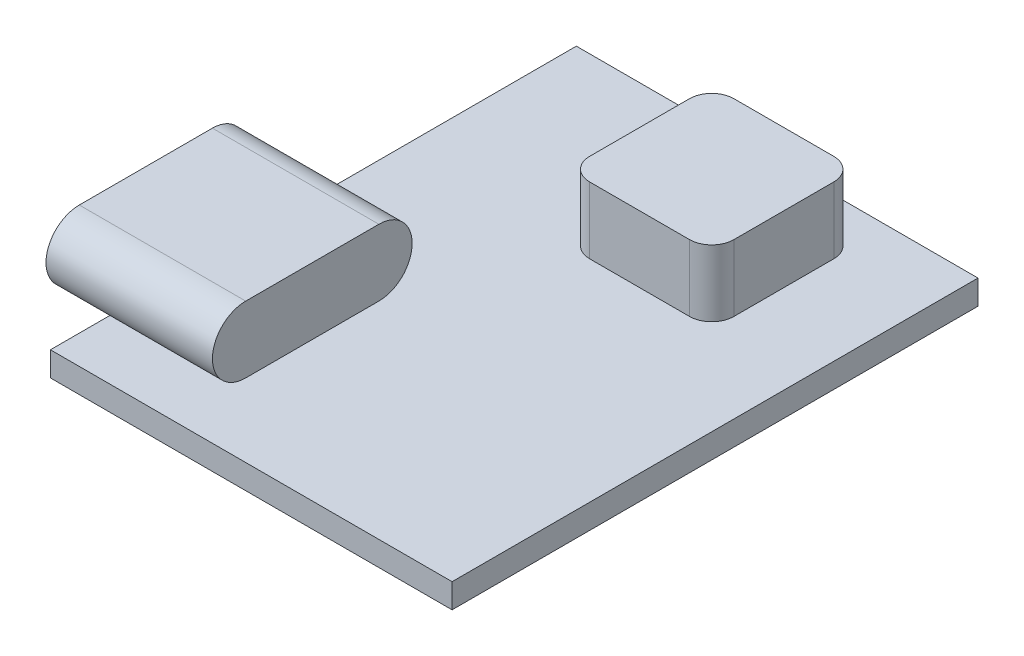
ISO-10303-21;
HEADER;
FILE_DESCRIPTION(('STEP AP214'),'2;1');
FILE_NAME('part.step','',(''),(''),'','','');
FILE_SCHEMA(('AUTOMOTIVE_DESIGN { 1 0 10303 214 1 1 1 1 }'));
ENDSEC;
DATA;
#1=APPLICATION_CONTEXT('core data for automotive mechanical design processes');
#2=APPLICATION_PROTOCOL_DEFINITION('international standard','automotive_design',2000,#1);
#3=PRODUCT_CONTEXT('',#1,'mechanical');
#4=PRODUCT('Part','Part','',(#3));
#5=PRODUCT_RELATED_PRODUCT_CATEGORY('part','',(#4));
#6=PRODUCT_DEFINITION_FORMATION('','',#4);
#7=PRODUCT_DEFINITION_CONTEXT('part definition',#1,'design');
#8=PRODUCT_DEFINITION('design','',#6,#7);
#9=PRODUCT_DEFINITION_SHAPE('','',#8);
#10=(LENGTH_UNIT() NAMED_UNIT(*) SI_UNIT(.MILLI.,.METRE.));
#11=(NAMED_UNIT(*) PLANE_ANGLE_UNIT() SI_UNIT($,.RADIAN.));
#12=(NAMED_UNIT(*) SI_UNIT($,.STERADIAN.) SOLID_ANGLE_UNIT());
#13=UNCERTAINTY_MEASURE_WITH_UNIT(LENGTH_MEASURE(1.E-05),#10,'distance_accuracy_value','');
#14=(GEOMETRIC_REPRESENTATION_CONTEXT(3) GLOBAL_UNCERTAINTY_ASSIGNED_CONTEXT((#13)) GLOBAL_UNIT_ASSIGNED_CONTEXT((#10,
#11,#12)) REPRESENTATION_CONTEXT('',''));
#15=CARTESIAN_POINT('',(0.,0.,0.));
#16=DIRECTION('',(0.,0.,1.));
#17=DIRECTION('',(1.,0.,0.));
#18=AXIS2_PLACEMENT_3D('',#15,#16,#17);
#19=CARTESIAN_POINT('',(-1.45,4.1,-10.35));
#20=DIRECTION('',(1.,0.,0.));
#21=DIRECTION('',(0.,0.,-1.));
#22=AXIS2_PLACEMENT_3D('',#19,#20,#21);
#23=PLANE('',#22);
#24=DIRECTION('',(0.,0.,1.));
#25=VECTOR('',#24,1.);
#26=CARTESIAN_POINT('',(-1.45,4.1,-10.35));
#27=LINE('',#26,#25);
#28=CARTESIAN_POINT('',(-1.45,4.1,-9.35));
#29=VERTEX_POINT('',#28);
#30=CARTESIAN_POINT('',(-1.45,4.1,-4.85));
#31=VERTEX_POINT('',#30);
#32=EDGE_CURVE('E144',#29,#31,#27,.T.);
#33=ORIENTED_EDGE('',*,*,#32,.F.);
#34=DIRECTION('',(0.,-1.,0.));
#35=VECTOR('',#34,1.);
#36=CARTESIAN_POINT('',(-1.45,4.1,-9.35));
#37=LINE('',#36,#35);
#38=CARTESIAN_POINT('',(-1.45,1.1,-9.35));
#39=VERTEX_POINT('',#38);
#40=EDGE_CURVE('E170',#29,#39,#37,.T.);
#41=ORIENTED_EDGE('',*,*,#40,.T.);
#42=DIRECTION('',(0.,0.,1.));
#43=VECTOR('',#42,1.);
#44=CARTESIAN_POINT('',(-1.45,1.1,-10.35));
#45=LINE('',#44,#43);
#46=CARTESIAN_POINT('',(-1.45,1.1,-4.85));
#47=VERTEX_POINT('',#46);
#48=EDGE_CURVE('E176',#39,#47,#45,.T.);
#49=ORIENTED_EDGE('',*,*,#48,.T.);
#50=DIRECTION('',(0.,-1.,0.));
#51=VECTOR('',#50,1.);
#52=CARTESIAN_POINT('',(-1.45,4.1,-4.85));
#53=LINE('',#52,#51);
#54=EDGE_CURVE('E168',#47,#31,#53,.F.);
#55=ORIENTED_EDGE('',*,*,#54,.T.);
#56=EDGE_LOOP('',(#33,#41,#49,#55));
#57=FACE_BOUND('',#56,.T.);
#58=ADVANCED_FACE('F52',(#57),#23,.F.);
#59=CARTESIAN_POINT('',(-1.45,4.1,-3.85));
#60=DIRECTION('',(0.,0.,-1.));
#61=DIRECTION('',(-1.,0.,0.));
#62=AXIS2_PLACEMENT_3D('',#59,#60,#61);
#63=PLANE('',#62);
#64=DIRECTION('',(1.,0.,0.));
#65=VECTOR('',#64,1.);
#66=CARTESIAN_POINT('',(-1.45,4.1,-3.85));
#67=LINE('',#66,#65);
#68=CARTESIAN_POINT('',(-0.449999999999999,4.1,-3.85));
#69=VERTEX_POINT('',#68);
#70=CARTESIAN_POINT('',(4.05,4.1,-3.85));
#71=VERTEX_POINT('',#70);
#72=EDGE_CURVE('E147',#69,#71,#67,.T.);
#73=ORIENTED_EDGE('',*,*,#72,.F.);
#74=DIRECTION('',(0.,-1.,0.));
#75=VECTOR('',#74,1.);
#76=CARTESIAN_POINT('',(-0.449999999999999,4.1,-3.85));
#77=LINE('',#76,#75);
#78=CARTESIAN_POINT('',(-0.449999999999999,1.1,-3.85));
#79=VERTEX_POINT('',#78);
#80=EDGE_CURVE('E12',#69,#79,#77,.T.);
#81=ORIENTED_EDGE('',*,*,#80,.T.);
#82=DIRECTION('',(1.,0.,0.));
#83=VECTOR('',#82,1.);
#84=CARTESIAN_POINT('',(-1.45,1.1,-3.85));
#85=LINE('',#84,#83);
#86=CARTESIAN_POINT('',(4.05,1.1,-3.85));
#87=VERTEX_POINT('',#86);
#88=EDGE_CURVE('E149',#79,#87,#85,.T.);
#89=ORIENTED_EDGE('',*,*,#88,.T.);
#90=DIRECTION('',(0.,-1.,0.));
#91=VECTOR('',#90,1.);
#92=CARTESIAN_POINT('',(4.05,4.1,-3.85));
#93=LINE('',#92,#91);
#94=EDGE_CURVE('E60',#87,#71,#93,.F.);
#95=ORIENTED_EDGE('',*,*,#94,.T.);
#96=EDGE_LOOP('',(#73,#81,#89,#95));
#97=FACE_BOUND('',#96,.T.);
#98=ADVANCED_FACE('F195',(#97),#63,.F.);
#99=CARTESIAN_POINT('',(5.05,4.1,-10.35));
#100=DIRECTION('',(-1.,0.,0.));
#101=DIRECTION('',(0.,0.,1.));
#102=AXIS2_PLACEMENT_3D('',#99,#100,#101);
#103=PLANE('',#102);
#104=DIRECTION('',(0.,0.,-1.));
#105=VECTOR('',#104,1.);
#106=CARTESIAN_POINT('',(5.05,1.1,-10.35));
#107=LINE('',#106,#105);
#108=CARTESIAN_POINT('',(5.05,1.1,-4.85));
#109=VERTEX_POINT('',#108);
#110=CARTESIAN_POINT('',(5.05,1.1,-9.35));
#111=VERTEX_POINT('',#110);
#112=EDGE_CURVE('E145',#109,#111,#107,.T.);
#113=ORIENTED_EDGE('',*,*,#112,.T.);
#114=DIRECTION('',(0.,-1.,0.));
#115=VECTOR('',#114,1.);
#116=CARTESIAN_POINT('',(5.05,4.1,-9.35));
#117=LINE('',#116,#115);
#118=CARTESIAN_POINT('',(5.05,4.1,-9.35));
#119=VERTEX_POINT('',#118);
#120=EDGE_CURVE('E123',#111,#119,#117,.F.);
#121=ORIENTED_EDGE('',*,*,#120,.T.);
#122=DIRECTION('',(0.,0.,-1.));
#123=VECTOR('',#122,1.);
#124=CARTESIAN_POINT('',(5.05,4.1,-10.35));
#125=LINE('',#124,#123);
#126=CARTESIAN_POINT('',(5.05,4.1,-4.85));
#127=VERTEX_POINT('',#126);
#128=EDGE_CURVE('E184',#127,#119,#125,.T.);
#129=ORIENTED_EDGE('',*,*,#128,.F.);
#130=DIRECTION('',(0.,-1.,0.));
#131=VECTOR('',#130,1.);
#132=CARTESIAN_POINT('',(5.05,4.1,-4.85));
#133=LINE('',#132,#131);
#134=EDGE_CURVE('E128',#127,#109,#133,.T.);
#135=ORIENTED_EDGE('',*,*,#134,.T.);
#136=EDGE_LOOP('',(#113,#121,#129,#135));
#137=FACE_BOUND('',#136,.T.);
#138=ADVANCED_FACE('F194',(#137),#103,.F.);
#139=CARTESIAN_POINT('',(-1.45,4.1,-10.35));
#140=DIRECTION('',(0.,0.,1.));
#141=DIRECTION('',(1.,0.,0.));
#142=AXIS2_PLACEMENT_3D('',#139,#140,#141);
#143=PLANE('',#142);
#144=DIRECTION('',(-1.,0.,0.));
#145=VECTOR('',#144,1.);
#146=CARTESIAN_POINT('',(-1.45,4.1,-10.35));
#147=LINE('',#146,#145);
#148=CARTESIAN_POINT('',(4.05,4.1,-10.35));
#149=VERTEX_POINT('',#148);
#150=CARTESIAN_POINT('',(-0.45,4.1,-10.35));
#151=VERTEX_POINT('',#150);
#152=EDGE_CURVE('E138',#149,#151,#147,.T.);
#153=ORIENTED_EDGE('',*,*,#152,.F.);
#154=DIRECTION('',(0.,-1.,0.));
#155=VECTOR('',#154,1.);
#156=CARTESIAN_POINT('',(4.05,4.1,-10.35));
#157=LINE('',#156,#155);
#158=CARTESIAN_POINT('',(4.05,1.1,-10.35));
#159=VERTEX_POINT('',#158);
#160=EDGE_CURVE('E122',#149,#159,#157,.T.);
#161=ORIENTED_EDGE('',*,*,#160,.T.);
#162=DIRECTION('',(-1.,0.,0.));
#163=VECTOR('',#162,1.);
#164=CARTESIAN_POINT('',(-1.45,1.1,-10.35));
#165=LINE('',#164,#163);
#166=CARTESIAN_POINT('',(-0.45,1.1,-10.35));
#167=VERTEX_POINT('',#166);
#168=EDGE_CURVE('E135',#159,#167,#165,.T.);
#169=ORIENTED_EDGE('',*,*,#168,.T.);
#170=DIRECTION('',(0.,-1.,0.));
#171=VECTOR('',#170,1.);
#172=CARTESIAN_POINT('',(-0.45,4.1,-10.35));
#173=LINE('',#172,#171);
#174=EDGE_CURVE('E140',#167,#151,#173,.F.);
#175=ORIENTED_EDGE('',*,*,#174,.T.);
#176=EDGE_LOOP('',(#153,#161,#169,#175));
#177=FACE_BOUND('',#176,.T.);
#178=ADVANCED_FACE('F134',(#177),#143,.F.);
#179=CARTESIAN_POINT('',(0.,4.1,0.));
#180=DIRECTION('',(0.,1.,0.));
#181=DIRECTION('',(0.,0.,1.));
#182=AXIS2_PLACEMENT_3D('',#179,#180,#181);
#183=PLANE('',#182);
#184=ORIENTED_EDGE('',*,*,#128,.T.);
#185=CARTESIAN_POINT('',(4.05,4.1,-9.35));
#186=DIRECTION('',(0.,1.,0.));
#187=DIRECTION('',(0.,0.,1.));
#188=AXIS2_PLACEMENT_3D('',#185,#186,#187);
#189=CIRCLE('',#188,1.);
#190=EDGE_CURVE('E166',#119,#149,#189,.T.);
#191=ORIENTED_EDGE('',*,*,#190,.T.);
#192=ORIENTED_EDGE('',*,*,#152,.T.);
#193=CARTESIAN_POINT('',(-0.45,4.1,-9.35));
#194=DIRECTION('',(0.,1.,0.));
#195=DIRECTION('',(0.,0.,1.));
#196=AXIS2_PLACEMENT_3D('',#193,#194,#195);
#197=CIRCLE('',#196,1.);
#198=EDGE_CURVE('E164',#151,#29,#197,.T.);
#199=ORIENTED_EDGE('',*,*,#198,.T.);
#200=ORIENTED_EDGE('',*,*,#32,.T.);
#201=CARTESIAN_POINT('',(-0.449999999999999,4.1,-4.85));
#202=DIRECTION('',(0.,1.,0.));
#203=DIRECTION('',(0.,0.,1.));
#204=AXIS2_PLACEMENT_3D('',#201,#202,#203);
#205=CIRCLE('',#204,1.);
#206=EDGE_CURVE('E73',#31,#69,#205,.T.);
#207=ORIENTED_EDGE('',*,*,#206,.T.);
#208=ORIENTED_EDGE('',*,*,#72,.T.);
#209=CARTESIAN_POINT('',(4.05,4.1,-4.85));
#210=DIRECTION('',(0.,1.,0.));
#211=DIRECTION('',(0.,0.,1.));
#212=AXIS2_PLACEMENT_3D('',#209,#210,#211);
#213=CIRCLE('',#212,1.);
#214=EDGE_CURVE('E161',#71,#127,#213,.T.);
#215=ORIENTED_EDGE('',*,*,#214,.T.);
#216=EDGE_LOOP('',(#184,#191,#192,#199,#200,#207,#208,#215));
#217=FACE_BOUND('',#216,.T.);
#218=ADVANCED_FACE('F188',(#217),#183,.T.);
#219=CARTESIAN_POINT('',(0.,1.1,0.));
#220=DIRECTION('',(0.,1.,0.));
#221=DIRECTION('',(0.,0.,1.));
#222=AXIS2_PLACEMENT_3D('',#219,#220,#221);
#223=PLANE('',#222);
#224=ORIENTED_EDGE('',*,*,#168,.F.);
#225=CARTESIAN_POINT('',(4.05,1.1,-9.35));
#226=DIRECTION('',(0.,1.,0.));
#227=DIRECTION('',(0.,0.,1.));
#228=AXIS2_PLACEMENT_3D('',#225,#226,#227);
#229=CIRCLE('',#228,1.);
#230=EDGE_CURVE('E118',#159,#111,#229,.F.);
#231=ORIENTED_EDGE('',*,*,#230,.T.);
#232=ORIENTED_EDGE('',*,*,#112,.F.);
#233=CARTESIAN_POINT('',(4.05,1.1,-4.85));
#234=DIRECTION('',(0.,1.,0.));
#235=DIRECTION('',(0.,0.,1.));
#236=AXIS2_PLACEMENT_3D('',#233,#234,#235);
#237=CIRCLE('',#236,1.);
#238=EDGE_CURVE('E139',#109,#87,#237,.F.);
#239=ORIENTED_EDGE('',*,*,#238,.T.);
#240=ORIENTED_EDGE('',*,*,#88,.F.);
#241=CARTESIAN_POINT('',(-0.449999999999999,1.1,-4.85));
#242=DIRECTION('',(0.,1.,0.));
#243=DIRECTION('',(0.,0.,1.));
#244=AXIS2_PLACEMENT_3D('',#241,#242,#243);
#245=CIRCLE('',#244,1.);
#246=EDGE_CURVE('E155',#79,#47,#245,.F.);
#247=ORIENTED_EDGE('',*,*,#246,.T.);
#248=ORIENTED_EDGE('',*,*,#48,.F.);
#249=CARTESIAN_POINT('',(-0.45,1.1,-9.35));
#250=DIRECTION('',(0.,1.,0.));
#251=DIRECTION('',(0.,0.,1.));
#252=AXIS2_PLACEMENT_3D('',#249,#250,#251);
#253=CIRCLE('',#252,1.);
#254=EDGE_CURVE('E129',#39,#167,#253,.F.);
#255=ORIENTED_EDGE('',*,*,#254,.T.);
#256=EDGE_LOOP('',(#224,#231,#232,#239,#240,#247,#248,#255));
#257=FACE_BOUND('',#256,.T.);
#258=ADVANCED_FACE('F142',(#257),#223,.F.);
#259=CARTESIAN_POINT('',(4.05,4.1,-9.35));
#260=DIRECTION('',(0.,-1.,0.));
#261=DIRECTION('',(0.,0.,-1.));
#262=AXIS2_PLACEMENT_3D('',#259,#260,#261);
#263=CYLINDRICAL_SURFACE('',#262,1.);
#264=ORIENTED_EDGE('',*,*,#190,.F.);
#265=ORIENTED_EDGE('',*,*,#120,.F.);
#266=ORIENTED_EDGE('',*,*,#230,.F.);
#267=ORIENTED_EDGE('',*,*,#160,.F.);
#268=EDGE_LOOP('',(#264,#265,#266,#267));
#269=FACE_BOUND('',#268,.T.);
#270=ADVANCED_FACE('F121',(#269),#263,.T.);
#271=CARTESIAN_POINT('',(-0.45,4.1,-9.35));
#272=DIRECTION('',(0.,-1.,0.));
#273=DIRECTION('',(0.,0.,-1.));
#274=AXIS2_PLACEMENT_3D('',#271,#272,#273);
#275=CYLINDRICAL_SURFACE('',#274,1.);
#276=ORIENTED_EDGE('',*,*,#198,.F.);
#277=ORIENTED_EDGE('',*,*,#174,.F.);
#278=ORIENTED_EDGE('',*,*,#254,.F.);
#279=ORIENTED_EDGE('',*,*,#40,.F.);
#280=EDGE_LOOP('',(#276,#277,#278,#279));
#281=FACE_BOUND('',#280,.T.);
#282=ADVANCED_FACE('F198',(#281),#275,.T.);
#283=CARTESIAN_POINT('',(-0.449999999999999,4.1,-4.85));
#284=DIRECTION('',(0.,-1.,0.));
#285=DIRECTION('',(0.,0.,-1.));
#286=AXIS2_PLACEMENT_3D('',#283,#284,#285);
#287=CYLINDRICAL_SURFACE('',#286,1.);
#288=ORIENTED_EDGE('',*,*,#206,.F.);
#289=ORIENTED_EDGE('',*,*,#54,.F.);
#290=ORIENTED_EDGE('',*,*,#246,.F.);
#291=ORIENTED_EDGE('',*,*,#80,.F.);
#292=EDGE_LOOP('',(#288,#289,#290,#291));
#293=FACE_BOUND('',#292,.T.);
#294=ADVANCED_FACE('F197',(#293),#287,.T.);
#295=CARTESIAN_POINT('',(4.05,4.1,-4.85));
#296=DIRECTION('',(0.,-1.,0.));
#297=DIRECTION('',(0.,0.,-1.));
#298=AXIS2_PLACEMENT_3D('',#295,#296,#297);
#299=CYLINDRICAL_SURFACE('',#298,1.);
#300=ORIENTED_EDGE('',*,*,#214,.F.);
#301=ORIENTED_EDGE('',*,*,#94,.F.);
#302=ORIENTED_EDGE('',*,*,#238,.F.);
#303=ORIENTED_EDGE('',*,*,#134,.F.);
#304=EDGE_LOOP('',(#300,#301,#302,#303));
#305=FACE_BOUND('',#304,.T.);
#306=ADVANCED_FACE('F54',(#305),#299,.T.);
#307=CLOSED_SHELL('',(#58,#98,#138,#178,#218,#258,#270,#282,#294,#306));
#308=MANIFOLD_SOLID_BREP('B2',#307);
#309=CARTESIAN_POINT('',(-3.55,2.6,2.55));
#310=DIRECTION('',(-1.,0.,0.));
#311=DIRECTION('',(0.,0.,1.));
#312=AXIS2_PLACEMENT_3D('',#309,#310,#311);
#313=CYLINDRICAL_SURFACE('',#312,1.5);
#314=DIRECTION('',(-1.,0.,0.));
#315=VECTOR('',#314,1.);
#316=CARTESIAN_POINT('',(-3.55,1.1,2.55));
#317=LINE('',#316,#315);
#318=CARTESIAN_POINT('',(-3.55,1.1,2.55));
#319=VERTEX_POINT('',#318);
#320=CARTESIAN_POINT('',(-11.05,1.1,2.55));
#321=VERTEX_POINT('',#320);
#322=EDGE_CURVE('E292',#319,#321,#317,.T.);
#323=ORIENTED_EDGE('',*,*,#322,.T.);
#324=CARTESIAN_POINT('',(-11.05,2.6,2.55));
#325=DIRECTION('',(-1.,0.,0.));
#326=DIRECTION('',(0.,0.,1.));
#327=AXIS2_PLACEMENT_3D('',#324,#325,#326);
#328=CIRCLE('',#327,1.5);
#329=CARTESIAN_POINT('',(-11.05,4.1,2.55));
#330=VERTEX_POINT('',#329);
#331=EDGE_CURVE('E394',#330,#321,#328,.T.);
#332=ORIENTED_EDGE('',*,*,#331,.F.);
#333=DIRECTION('',(-1.,0.,0.));
#334=VECTOR('',#333,1.);
#335=CARTESIAN_POINT('',(-3.55,4.1,2.55));
#336=LINE('',#335,#334);
#337=CARTESIAN_POINT('',(-3.55,4.1,2.55));
#338=VERTEX_POINT('',#337);
#339=EDGE_CURVE('E50',#338,#330,#336,.T.);
#340=ORIENTED_EDGE('',*,*,#339,.F.);
#341=CARTESIAN_POINT('',(-3.55,2.6,2.55));
#342=DIRECTION('',(-1.,0.,0.));
#343=DIRECTION('',(0.,0.,1.));
#344=AXIS2_PLACEMENT_3D('',#341,#342,#343);
#345=CIRCLE('',#344,1.5);
#346=EDGE_CURVE('E406',#338,#319,#345,.T.);
#347=ORIENTED_EDGE('',*,*,#346,.T.);
#348=EDGE_LOOP('',(#323,#332,#340,#347));
#349=FACE_BOUND('',#348,.T.);
#350=ADVANCED_FACE('F289',(#349),#313,.T.);
#351=CARTESIAN_POINT('',(-3.55,4.1,2.55));
#352=DIRECTION('',(0.,1.,0.));
#353=DIRECTION('',(0.,0.,1.));
#354=AXIS2_PLACEMENT_3D('',#351,#352,#353);
#355=PLANE('',#354);
#356=ORIENTED_EDGE('',*,*,#339,.T.);
#357=DIRECTION('',(0.,0.,-1.));
#358=VECTOR('',#357,1.);
#359=CARTESIAN_POINT('',(-11.05,4.1,2.55));
#360=LINE('',#359,#358);
#361=CARTESIAN_POINT('',(-11.05,4.1,8.55));
#362=VERTEX_POINT('',#361);
#363=EDGE_CURVE('E403',#362,#330,#360,.T.);
#364=ORIENTED_EDGE('',*,*,#363,.F.);
#365=DIRECTION('',(-1.,0.,0.));
#366=VECTOR('',#365,1.);
#367=CARTESIAN_POINT('',(-3.55,4.1,8.55));
#368=LINE('',#367,#366);
#369=CARTESIAN_POINT('',(-3.55,4.1,8.55));
#370=VERTEX_POINT('',#369);
#371=EDGE_CURVE('E297',#370,#362,#368,.T.);
#372=ORIENTED_EDGE('',*,*,#371,.F.);
#373=DIRECTION('',(0.,0.,-1.));
#374=VECTOR('',#373,1.);
#375=CARTESIAN_POINT('',(-3.55,4.1,2.55));
#376=LINE('',#375,#374);
#377=EDGE_CURVE('E414',#370,#338,#376,.T.);
#378=ORIENTED_EDGE('',*,*,#377,.T.);
#379=EDGE_LOOP('',(#356,#364,#372,#378));
#380=FACE_BOUND('',#379,.T.);
#381=ADVANCED_FACE('F427',(#380),#355,.T.);
#382=CARTESIAN_POINT('',(-3.55,2.6,8.55));
#383=DIRECTION('',(-1.,0.,0.));
#384=DIRECTION('',(0.,0.,1.));
#385=AXIS2_PLACEMENT_3D('',#382,#383,#384);
#386=CYLINDRICAL_SURFACE('',#385,1.5);
#387=ORIENTED_EDGE('',*,*,#371,.T.);
#388=CARTESIAN_POINT('',(-11.05,2.6,8.55));
#389=DIRECTION('',(-1.,0.,0.));
#390=DIRECTION('',(0.,0.,1.));
#391=AXIS2_PLACEMENT_3D('',#388,#389,#390);
#392=CIRCLE('',#391,1.5);
#393=CARTESIAN_POINT('',(-11.05,1.1,8.55));
#394=VERTEX_POINT('',#393);
#395=EDGE_CURVE('E400',#394,#362,#392,.T.);
#396=ORIENTED_EDGE('',*,*,#395,.F.);
#397=DIRECTION('',(-1.,0.,0.));
#398=VECTOR('',#397,1.);
#399=CARTESIAN_POINT('',(-3.55,1.1,8.55));
#400=LINE('',#399,#398);
#401=CARTESIAN_POINT('',(-3.55,1.1,8.55));
#402=VERTEX_POINT('',#401);
#403=EDGE_CURVE('E417',#402,#394,#400,.T.);
#404=ORIENTED_EDGE('',*,*,#403,.F.);
#405=CARTESIAN_POINT('',(-3.55,2.6,8.55));
#406=DIRECTION('',(-1.,0.,0.));
#407=DIRECTION('',(0.,0.,1.));
#408=AXIS2_PLACEMENT_3D('',#405,#406,#407);
#409=CIRCLE('',#408,1.5);
#410=EDGE_CURVE('E411',#402,#370,#409,.T.);
#411=ORIENTED_EDGE('',*,*,#410,.T.);
#412=EDGE_LOOP('',(#387,#396,#404,#411));
#413=FACE_BOUND('',#412,.T.);
#414=ADVANCED_FACE('F433',(#413),#386,.T.);
#415=CARTESIAN_POINT('',(-3.55,1.1,2.55));
#416=DIRECTION('',(0.,-1.,0.));
#417=DIRECTION('',(0.,0.,-1.));
#418=AXIS2_PLACEMENT_3D('',#415,#416,#417);
#419=PLANE('',#418);
#420=ORIENTED_EDGE('',*,*,#403,.T.);
#421=DIRECTION('',(0.,0.,1.));
#422=VECTOR('',#421,1.);
#423=CARTESIAN_POINT('',(-11.05,1.1,2.55));
#424=LINE('',#423,#422);
#425=EDGE_CURVE('E397',#321,#394,#424,.T.);
#426=ORIENTED_EDGE('',*,*,#425,.F.);
#427=ORIENTED_EDGE('',*,*,#322,.F.);
#428=DIRECTION('',(0.,0.,1.));
#429=VECTOR('',#428,1.);
#430=CARTESIAN_POINT('',(-3.55,1.1,2.55));
#431=LINE('',#430,#429);
#432=EDGE_CURVE('E408',#319,#402,#431,.T.);
#433=ORIENTED_EDGE('',*,*,#432,.T.);
#434=EDGE_LOOP('',(#420,#426,#427,#433));
#435=FACE_BOUND('',#434,.T.);
#436=ADVANCED_FACE('F421',(#435),#419,.T.);
#437=CARTESIAN_POINT('',(-3.55,2.6,2.55));
#438=DIRECTION('',(-1.,0.,0.));
#439=DIRECTION('',(0.,0.,1.));
#440=AXIS2_PLACEMENT_3D('',#437,#438,#439);
#441=PLANE('',#440);
#442=ORIENTED_EDGE('',*,*,#346,.F.);
#443=ORIENTED_EDGE('',*,*,#377,.F.);
#444=ORIENTED_EDGE('',*,*,#410,.F.);
#445=ORIENTED_EDGE('',*,*,#432,.F.);
#446=EDGE_LOOP('',(#442,#443,#444,#445));
#447=FACE_BOUND('',#446,.T.);
#448=ADVANCED_FACE('F431',(#447),#441,.F.);
#449=CARTESIAN_POINT('',(-11.05,2.6,2.55));
#450=DIRECTION('',(-1.,0.,0.));
#451=DIRECTION('',(0.,0.,1.));
#452=AXIS2_PLACEMENT_3D('',#449,#450,#451);
#453=PLANE('',#452);
#454=CARTESIAN_POINT('',(-11.05,2.6,2.55));
#455=DIRECTION('',(-1.,0.,0.));
#456=DIRECTION('',(0.,0.,1.));
#457=AXIS2_PLACEMENT_3D('',#454,#455,#456);
#458=CIRCLE('',#457,1.2);
#459=CARTESIAN_POINT('',(-11.05,3.8,2.55));
#460=VERTEX_POINT('',#459);
#461=CARTESIAN_POINT('',(-11.05,1.4,2.55));
#462=VERTEX_POINT('',#461);
#463=EDGE_CURVE('E361',#460,#462,#458,.T.);
#464=ORIENTED_EDGE('',*,*,#463,.F.);
#465=DIRECTION('',(0.,0.,-1.));
#466=VECTOR('',#465,1.);
#467=CARTESIAN_POINT('',(-11.05,3.8,2.55));
#468=LINE('',#467,#466);
#469=CARTESIAN_POINT('',(-11.05,3.8,8.55));
#470=VERTEX_POINT('',#469);
#471=EDGE_CURVE('E378',#470,#460,#468,.T.);
#472=ORIENTED_EDGE('',*,*,#471,.F.);
#473=CARTESIAN_POINT('',(-11.05,2.6,8.55));
#474=DIRECTION('',(-1.,0.,0.));
#475=DIRECTION('',(0.,0.,1.));
#476=AXIS2_PLACEMENT_3D('',#473,#474,#475);
#477=CIRCLE('',#476,1.2);
#478=CARTESIAN_POINT('',(-11.05,1.4,8.55));
#479=VERTEX_POINT('',#478);
#480=EDGE_CURVE('E305',#479,#470,#477,.T.);
#481=ORIENTED_EDGE('',*,*,#480,.F.);
#482=DIRECTION('',(0.,0.,1.));
#483=VECTOR('',#482,1.);
#484=CARTESIAN_POINT('',(-11.05,1.4,2.55));
#485=LINE('',#484,#483);
#486=EDGE_CURVE('E391',#462,#479,#485,.T.);
#487=ORIENTED_EDGE('',*,*,#486,.F.);
#488=EDGE_LOOP('',(#464,#472,#481,#487));
#489=FACE_BOUND('',#488,.T.);
#490=ORIENTED_EDGE('',*,*,#331,.T.);
#491=ORIENTED_EDGE('',*,*,#425,.T.);
#492=ORIENTED_EDGE('',*,*,#395,.T.);
#493=ORIENTED_EDGE('',*,*,#363,.T.);
#494=EDGE_LOOP('',(#490,#491,#492,#493));
#495=FACE_BOUND('',#494,.T.);
#496=ADVANCED_FACE('F424',(#489,#495),#453,.T.);
#497=CARTESIAN_POINT('',(-3.55,2.6,2.55));
#498=DIRECTION('',(-1.,0.,0.));
#499=DIRECTION('',(0.,0.,1.));
#500=AXIS2_PLACEMENT_3D('',#497,#498,#499);
#501=CYLINDRICAL_SURFACE('',#500,1.2);
#502=DIRECTION('',(-1.,0.,0.));
#503=VECTOR('',#502,1.);
#504=CARTESIAN_POINT('',(-3.55,1.4,2.55));
#505=LINE('',#504,#503);
#506=CARTESIAN_POINT('',(-3.85,1.4,2.55));
#507=VERTEX_POINT('',#506);
#508=EDGE_CURVE('E354',#507,#462,#505,.T.);
#509=ORIENTED_EDGE('',*,*,#508,.F.);
#510=CARTESIAN_POINT('',(-3.85,2.6,2.55));
#511=DIRECTION('',(-1.,0.,0.));
#512=DIRECTION('',(0.,0.,1.));
#513=AXIS2_PLACEMENT_3D('',#510,#511,#512);
#514=CIRCLE('',#513,1.2);
#515=CARTESIAN_POINT('',(-3.85,3.8,2.55));
#516=VERTEX_POINT('',#515);
#517=EDGE_CURVE('E358',#516,#507,#514,.T.);
#518=ORIENTED_EDGE('',*,*,#517,.F.);
#519=DIRECTION('',(1.,0.,0.));
#520=VECTOR('',#519,1.);
#521=CARTESIAN_POINT('',(-3.55,3.8,2.55));
#522=LINE('',#521,#520);
#523=EDGE_CURVE('E384',#516,#460,#522,.F.);
#524=ORIENTED_EDGE('',*,*,#523,.T.);
#525=ORIENTED_EDGE('',*,*,#463,.T.);
#526=EDGE_LOOP('',(#509,#518,#524,#525));
#527=FACE_BOUND('',#526,.T.);
#528=ADVANCED_FACE('F356',(#527),#501,.F.);
#529=CARTESIAN_POINT('',(-3.55,3.8,2.55));
#530=DIRECTION('',(0.,1.,0.));
#531=DIRECTION('',(0.,0.,1.));
#532=AXIS2_PLACEMENT_3D('',#529,#530,#531);
#533=PLANE('',#532);
#534=ORIENTED_EDGE('',*,*,#523,.F.);
#535=DIRECTION('',(0.,0.,-1.));
#536=VECTOR('',#535,1.);
#537=CARTESIAN_POINT('',(-3.85,3.8,2.55));
#538=LINE('',#537,#536);
#539=CARTESIAN_POINT('',(-3.85,3.8,8.55));
#540=VERTEX_POINT('',#539);
#541=EDGE_CURVE('E366',#540,#516,#538,.T.);
#542=ORIENTED_EDGE('',*,*,#541,.F.);
#543=DIRECTION('',(-1.,0.,0.));
#544=VECTOR('',#543,1.);
#545=CARTESIAN_POINT('',(-3.55,3.8,8.55));
#546=LINE('',#545,#544);
#547=EDGE_CURVE('E385',#540,#470,#546,.T.);
#548=ORIENTED_EDGE('',*,*,#547,.T.);
#549=ORIENTED_EDGE('',*,*,#471,.T.);
#550=EDGE_LOOP('',(#534,#542,#548,#549));
#551=FACE_BOUND('',#550,.T.);
#552=ADVANCED_FACE('F486',(#551),#533,.F.);
#553=CARTESIAN_POINT('',(-3.55,2.6,8.55));
#554=DIRECTION('',(-1.,0.,0.));
#555=DIRECTION('',(0.,0.,1.));
#556=AXIS2_PLACEMENT_3D('',#553,#554,#555);
#557=CYLINDRICAL_SURFACE('',#556,1.2);
#558=ORIENTED_EDGE('',*,*,#547,.F.);
#559=CARTESIAN_POINT('',(-3.85,2.6,8.55));
#560=DIRECTION('',(-1.,0.,0.));
#561=DIRECTION('',(0.,0.,1.));
#562=AXIS2_PLACEMENT_3D('',#559,#560,#561);
#563=CIRCLE('',#562,1.2);
#564=CARTESIAN_POINT('',(-3.85,1.4,8.55));
#565=VERTEX_POINT('',#564);
#566=EDGE_CURVE('E374',#565,#540,#563,.T.);
#567=ORIENTED_EDGE('',*,*,#566,.F.);
#568=DIRECTION('',(1.,0.,0.));
#569=VECTOR('',#568,1.);
#570=CARTESIAN_POINT('',(-3.55,1.4,8.55));
#571=LINE('',#570,#569);
#572=EDGE_CURVE('E365',#565,#479,#571,.F.);
#573=ORIENTED_EDGE('',*,*,#572,.T.);
#574=ORIENTED_EDGE('',*,*,#480,.T.);
#575=EDGE_LOOP('',(#558,#567,#573,#574));
#576=FACE_BOUND('',#575,.T.);
#577=ADVANCED_FACE('F495',(#576),#557,.F.);
#578=CARTESIAN_POINT('',(-3.55,1.4,2.55));
#579=DIRECTION('',(0.,-1.,0.));
#580=DIRECTION('',(0.,0.,-1.));
#581=AXIS2_PLACEMENT_3D('',#578,#579,#580);
#582=PLANE('',#581);
#583=ORIENTED_EDGE('',*,*,#572,.F.);
#584=DIRECTION('',(0.,0.,1.));
#585=VECTOR('',#584,1.);
#586=CARTESIAN_POINT('',(-3.85,1.4,2.55));
#587=LINE('',#586,#585);
#588=EDGE_CURVE('E369',#507,#565,#587,.T.);
#589=ORIENTED_EDGE('',*,*,#588,.F.);
#590=ORIENTED_EDGE('',*,*,#508,.T.);
#591=ORIENTED_EDGE('',*,*,#486,.T.);
#592=EDGE_LOOP('',(#583,#589,#590,#591));
#593=FACE_BOUND('',#592,.T.);
#594=ADVANCED_FACE('F370',(#593),#582,.F.);
#595=CARTESIAN_POINT('',(-3.85,2.6,2.55));
#596=DIRECTION('',(-1.,0.,0.));
#597=DIRECTION('',(0.,0.,1.));
#598=AXIS2_PLACEMENT_3D('',#595,#596,#597);
#599=PLANE('',#598);
#600=ORIENTED_EDGE('',*,*,#517,.T.);
#601=ORIENTED_EDGE('',*,*,#588,.T.);
#602=ORIENTED_EDGE('',*,*,#566,.T.);
#603=ORIENTED_EDGE('',*,*,#541,.T.);
#604=EDGE_LOOP('',(#600,#601,#602,#603));
#605=FACE_BOUND('',#604,.T.);
#606=ADVANCED_FACE('F376',(#605),#599,.T.);
#607=CLOSED_SHELL('',(#350,#381,#414,#436,#448,#496,#528,#552,#577,#594,#606));
#608=MANIFOLD_SOLID_BREP('B6',#607);
#609=CARTESIAN_POINT('',(9.05,1.1,-11.85));
#610=DIRECTION('',(-1.,0.,0.));
#611=DIRECTION('',(0.,0.,1.));
#612=AXIS2_PLACEMENT_3D('',#609,#610,#611);
#613=PLANE('',#612);
#614=DIRECTION('',(0.,0.,-1.));
#615=VECTOR('',#614,1.);
#616=CARTESIAN_POINT('',(9.05,0.,-11.85));
#617=LINE('',#616,#615);
#618=CARTESIAN_POINT('',(9.05,0.,11.85));
#619=VERTEX_POINT('',#618);
#620=CARTESIAN_POINT('',(9.05,0.,-11.85));
#621=VERTEX_POINT('',#620);
#622=EDGE_CURVE('E591',#619,#621,#617,.T.);
#623=ORIENTED_EDGE('',*,*,#622,.T.);
#624=DIRECTION('',(0.,-1.,0.));
#625=VECTOR('',#624,1.);
#626=CARTESIAN_POINT('',(9.05,1.1,-11.85));
#627=LINE('',#626,#625);
#628=CARTESIAN_POINT('',(9.05,1.1,-11.85));
#629=VERTEX_POINT('',#628);
#630=EDGE_CURVE('E287',#629,#621,#627,.T.);
#631=ORIENTED_EDGE('',*,*,#630,.F.);
#632=DIRECTION('',(0.,0.,-1.));
#633=VECTOR('',#632,1.);
#634=CARTESIAN_POINT('',(9.05,1.1,-11.85));
#635=LINE('',#634,#633);
#636=CARTESIAN_POINT('',(9.05,1.1,11.85));
#637=VERTEX_POINT('',#636);
#638=EDGE_CURVE('E579',#637,#629,#635,.T.);
#639=ORIENTED_EDGE('',*,*,#638,.F.);
#640=DIRECTION('',(0.,-1.,0.));
#641=VECTOR('',#640,1.);
#642=CARTESIAN_POINT('',(9.05,1.1,11.85));
#643=LINE('',#642,#641);
#644=EDGE_CURVE('E587',#637,#619,#643,.T.);
#645=ORIENTED_EDGE('',*,*,#644,.T.);
#646=EDGE_LOOP('',(#623,#631,#639,#645));
#647=FACE_BOUND('',#646,.T.);
#648=ADVANCED_FACE('F528',(#647),#613,.F.);
#649=CARTESIAN_POINT('',(-9.05,1.1,-11.85));
#650=DIRECTION('',(0.,0.,1.));
#651=DIRECTION('',(1.,0.,0.));
#652=AXIS2_PLACEMENT_3D('',#649,#650,#651);
#653=PLANE('',#652);
#654=DIRECTION('',(-1.,0.,0.));
#655=VECTOR('',#654,1.);
#656=CARTESIAN_POINT('',(-9.05,0.,-11.85));
#657=LINE('',#656,#655);
#658=CARTESIAN_POINT('',(-9.05,0.,-11.85));
#659=VERTEX_POINT('',#658);
#660=EDGE_CURVE('E583',#621,#659,#657,.T.);
#661=ORIENTED_EDGE('',*,*,#660,.T.);
#662=DIRECTION('',(0.,-1.,0.));
#663=VECTOR('',#662,1.);
#664=CARTESIAN_POINT('',(-9.05,1.1,-11.85));
#665=LINE('',#664,#663);
#666=CARTESIAN_POINT('',(-9.05,1.1,-11.85));
#667=VERTEX_POINT('',#666);
#668=EDGE_CURVE('E536',#667,#659,#665,.T.);
#669=ORIENTED_EDGE('',*,*,#668,.F.);
#670=DIRECTION('',(-1.,0.,0.));
#671=VECTOR('',#670,1.);
#672=CARTESIAN_POINT('',(-9.05,1.1,-11.85));
#673=LINE('',#672,#671);
#674=EDGE_CURVE('E574',#629,#667,#673,.T.);
#675=ORIENTED_EDGE('',*,*,#674,.F.);
#676=ORIENTED_EDGE('',*,*,#630,.T.);
#677=EDGE_LOOP('',(#661,#669,#675,#676));
#678=FACE_BOUND('',#677,.T.);
#679=ADVANCED_FACE('F582',(#678),#653,.F.);
#680=CARTESIAN_POINT('',(-9.05,1.1,-11.85));
#681=DIRECTION('',(1.,0.,0.));
#682=DIRECTION('',(0.,0.,-1.));
#683=AXIS2_PLACEMENT_3D('',#680,#681,#682);
#684=PLANE('',#683);
#685=DIRECTION('',(0.,0.,1.));
#686=VECTOR('',#685,1.);
#687=CARTESIAN_POINT('',(-9.05,0.,-11.85));
#688=LINE('',#687,#686);
#689=CARTESIAN_POINT('',(-9.05,0.,11.85));
#690=VERTEX_POINT('',#689);
#691=EDGE_CURVE('E561',#659,#690,#688,.T.);
#692=ORIENTED_EDGE('',*,*,#691,.T.);
#693=DIRECTION('',(0.,-1.,0.));
#694=VECTOR('',#693,1.);
#695=CARTESIAN_POINT('',(-9.05,1.1,11.85));
#696=LINE('',#695,#694);
#697=CARTESIAN_POINT('',(-9.05,1.1,11.85));
#698=VERTEX_POINT('',#697);
#699=EDGE_CURVE('E584',#698,#690,#696,.T.);
#700=ORIENTED_EDGE('',*,*,#699,.F.);
#701=DIRECTION('',(0.,0.,1.));
#702=VECTOR('',#701,1.);
#703=CARTESIAN_POINT('',(-9.05,1.1,-11.85));
#704=LINE('',#703,#702);
#705=EDGE_CURVE('E577',#667,#698,#704,.T.);
#706=ORIENTED_EDGE('',*,*,#705,.F.);
#707=ORIENTED_EDGE('',*,*,#668,.T.);
#708=EDGE_LOOP('',(#692,#700,#706,#707));
#709=FACE_BOUND('',#708,.T.);
#710=ADVANCED_FACE('F585',(#709),#684,.F.);
#711=CARTESIAN_POINT('',(-9.05,1.1,11.85));
#712=DIRECTION('',(0.,0.,-1.));
#713=DIRECTION('',(-1.,0.,0.));
#714=AXIS2_PLACEMENT_3D('',#711,#712,#713);
#715=PLANE('',#714);
#716=DIRECTION('',(1.,0.,0.));
#717=VECTOR('',#716,1.);
#718=CARTESIAN_POINT('',(-9.05,0.,11.85));
#719=LINE('',#718,#717);
#720=EDGE_CURVE('E567',#690,#619,#719,.T.);
#721=ORIENTED_EDGE('',*,*,#720,.T.);
#722=ORIENTED_EDGE('',*,*,#644,.F.);
#723=DIRECTION('',(1.,0.,0.));
#724=VECTOR('',#723,1.);
#725=CARTESIAN_POINT('',(-9.05,1.1,11.85));
#726=LINE('',#725,#724);
#727=EDGE_CURVE('E544',#698,#637,#726,.T.);
#728=ORIENTED_EDGE('',*,*,#727,.F.);
#729=ORIENTED_EDGE('',*,*,#699,.T.);
#730=EDGE_LOOP('',(#721,#722,#728,#729));
#731=FACE_BOUND('',#730,.T.);
#732=ADVANCED_FACE('F598',(#731),#715,.F.);
#733=CARTESIAN_POINT('',(0.,1.1,0.));
#734=DIRECTION('',(0.,1.,0.));
#735=DIRECTION('',(0.,0.,1.));
#736=AXIS2_PLACEMENT_3D('',#733,#734,#735);
#737=PLANE('',#736);
#738=ORIENTED_EDGE('',*,*,#638,.T.);
#739=ORIENTED_EDGE('',*,*,#674,.T.);
#740=ORIENTED_EDGE('',*,*,#705,.T.);
#741=ORIENTED_EDGE('',*,*,#727,.T.);
#742=EDGE_LOOP('',(#738,#739,#740,#741));
#743=FACE_BOUND('',#742,.T.);
#744=ADVANCED_FACE('F575',(#743),#737,.T.);
#745=CARTESIAN_POINT('',(0.,0.,0.));
#746=DIRECTION('',(0.,1.,0.));
#747=DIRECTION('',(0.,0.,1.));
#748=AXIS2_PLACEMENT_3D('',#745,#746,#747);
#749=PLANE('',#748);
#750=ORIENTED_EDGE('',*,*,#622,.F.);
#751=ORIENTED_EDGE('',*,*,#720,.F.);
#752=ORIENTED_EDGE('',*,*,#691,.F.);
#753=ORIENTED_EDGE('',*,*,#660,.F.);
#754=EDGE_LOOP('',(#750,#751,#752,#753));
#755=FACE_BOUND('',#754,.T.);
#756=ADVANCED_FACE('F601',(#755),#749,.F.);
#757=CLOSED_SHELL('',(#648,#679,#710,#732,#744,#756));
#758=MANIFOLD_SOLID_BREP('B44',#757);
#759=ADVANCED_BREP_SHAPE_REPRESENTATION('',(#18,#308,#608,#758),#14);
#760=SHAPE_DEFINITION_REPRESENTATION(#9,#759);
ENDSEC;
END-ISO-10303-21;
